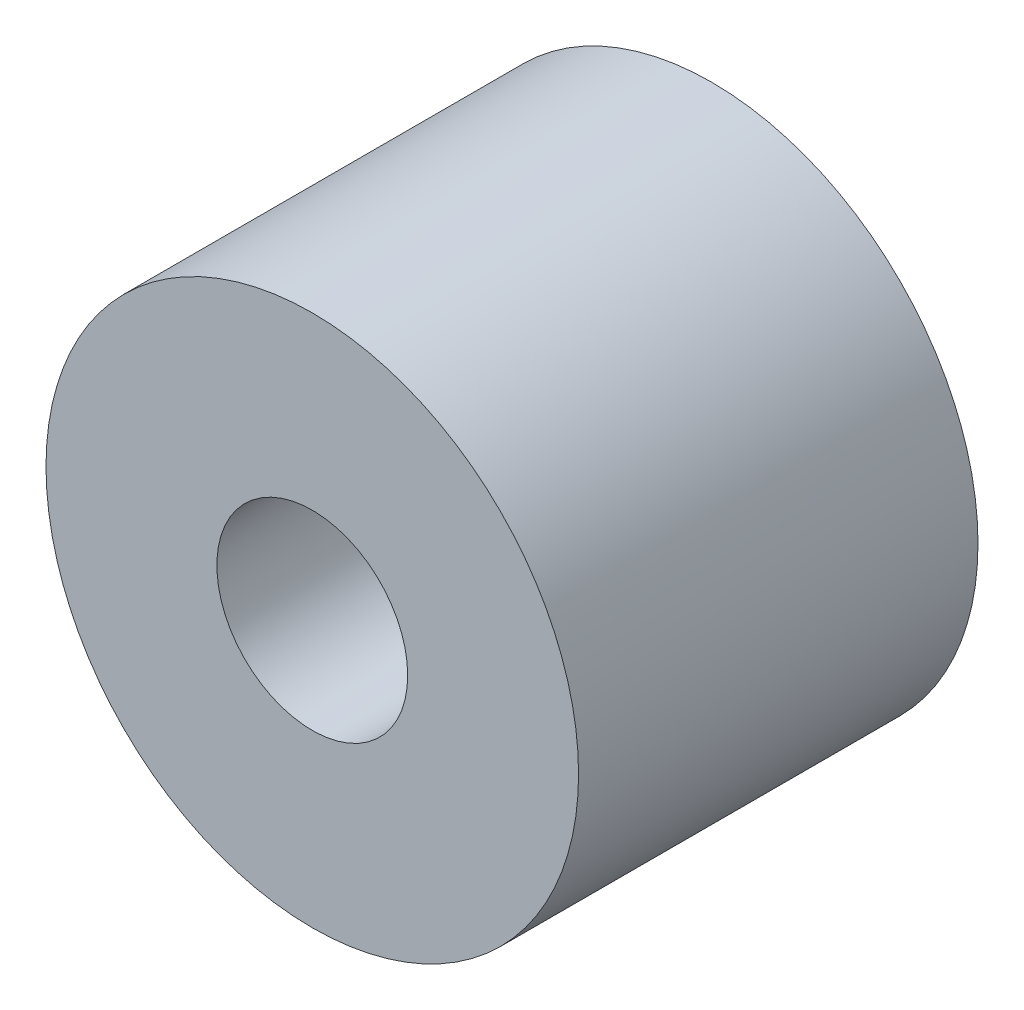
ISO-10303-21;
HEADER;
FILE_DESCRIPTION(('STEP AP214'),'2;1');
FILE_NAME('part.step','',(''),(''),'','','');
FILE_SCHEMA(('AUTOMOTIVE_DESIGN { 1 0 10303 214 1 1 1 1 }'));
ENDSEC;
DATA;
#1=APPLICATION_CONTEXT('core data for automotive mechanical design processes');
#2=APPLICATION_PROTOCOL_DEFINITION('international standard','automotive_design',2000,#1);
#3=PRODUCT_CONTEXT('',#1,'mechanical');
#4=PRODUCT('Part','Part','',(#3));
#5=PRODUCT_RELATED_PRODUCT_CATEGORY('part','',(#4));
#6=PRODUCT_DEFINITION_FORMATION('','',#4);
#7=PRODUCT_DEFINITION_CONTEXT('part definition',#1,'design');
#8=PRODUCT_DEFINITION('design','',#6,#7);
#9=PRODUCT_DEFINITION_SHAPE('','',#8);
#10=(LENGTH_UNIT() NAMED_UNIT(*) SI_UNIT(.MILLI.,.METRE.));
#11=(NAMED_UNIT(*) PLANE_ANGLE_UNIT() SI_UNIT($,.RADIAN.));
#12=(NAMED_UNIT(*) SI_UNIT($,.STERADIAN.) SOLID_ANGLE_UNIT());
#13=UNCERTAINTY_MEASURE_WITH_UNIT(LENGTH_MEASURE(1.E-05),#10,'distance_accuracy_value','');
#14=(GEOMETRIC_REPRESENTATION_CONTEXT(3) GLOBAL_UNCERTAINTY_ASSIGNED_CONTEXT((#13)) GLOBAL_UNIT_ASSIGNED_CONTEXT((#10,
#11,#12)) REPRESENTATION_CONTEXT('',''));
#15=CARTESIAN_POINT('',(0.,0.,0.));
#16=DIRECTION('',(0.,0.,1.));
#17=DIRECTION('',(1.,0.,0.));
#18=AXIS2_PLACEMENT_3D('',#15,#16,#17);
#19=CARTESIAN_POINT('',(0.,0.,9.));
#20=DIRECTION('',(0.,0.,1.));
#21=DIRECTION('',(1.,0.,0.));
#22=AXIS2_PLACEMENT_3D('',#19,#20,#21);
#23=PLANE('',#22);
#24=CARTESIAN_POINT('',(0.,0.,9.));
#25=DIRECTION('',(0.,0.,1.));
#26=DIRECTION('',(1.,0.,0.));
#27=AXIS2_PLACEMENT_3D('',#24,#25,#26);
#28=CIRCLE('',#27,6.);
#29=CARTESIAN_POINT('',(6.,0.,9.));
#30=VERTEX_POINT('',#29);
#31=EDGE_CURVE('E10',#30,#30,#28,.T.);
#32=ORIENTED_EDGE('',*,*,#31,.T.);
#33=EDGE_LOOP('',(#32));
#34=FACE_BOUND('',#33,.T.);
#35=CARTESIAN_POINT('',(0.,0.,9.));
#36=DIRECTION('',(0.,0.,1.));
#37=DIRECTION('',(1.,0.,0.));
#38=AXIS2_PLACEMENT_3D('',#35,#36,#37);
#39=CIRCLE('',#38,2.15);
#40=CARTESIAN_POINT('',(2.15,0.,9.));
#41=VERTEX_POINT('',#40);
#42=EDGE_CURVE('E50',#41,#41,#39,.T.);
#43=ORIENTED_EDGE('',*,*,#42,.F.);
#44=EDGE_LOOP('',(#43));
#45=FACE_BOUND('',#44,.T.);
#46=ADVANCED_FACE('F39',(#34,#45),#23,.T.);
#47=CARTESIAN_POINT('',(0.,0.,0.));
#48=DIRECTION('',(0.,0.,1.));
#49=DIRECTION('',(1.,0.,0.));
#50=AXIS2_PLACEMENT_3D('',#47,#48,#49);
#51=PLANE('',#50);
#52=CARTESIAN_POINT('',(0.,0.,0.));
#53=DIRECTION('',(0.,0.,1.));
#54=DIRECTION('',(1.,0.,0.));
#55=AXIS2_PLACEMENT_3D('',#52,#53,#54);
#56=CIRCLE('',#55,6.);
#57=CARTESIAN_POINT('',(6.,0.,0.));
#58=VERTEX_POINT('',#57);
#59=EDGE_CURVE('E43',#58,#58,#56,.T.);
#60=ORIENTED_EDGE('',*,*,#59,.F.);
#61=EDGE_LOOP('',(#60));
#62=FACE_BOUND('',#61,.T.);
#63=CARTESIAN_POINT('',(0.,0.,0.));
#64=DIRECTION('',(0.,0.,1.));
#65=DIRECTION('',(1.,0.,0.));
#66=AXIS2_PLACEMENT_3D('',#63,#64,#65);
#67=CIRCLE('',#66,2.15);
#68=CARTESIAN_POINT('',(2.15,0.,0.));
#69=VERTEX_POINT('',#68);
#70=EDGE_CURVE('E52',#69,#69,#67,.T.);
#71=ORIENTED_EDGE('',*,*,#70,.T.);
#72=EDGE_LOOP('',(#71));
#73=FACE_BOUND('',#72,.T.);
#74=ADVANCED_FACE('F62',(#62,#73),#51,.F.);
#75=CARTESIAN_POINT('',(0.,0.,9.));
#76=DIRECTION('',(0.,0.,-1.));
#77=DIRECTION('',(-1.,0.,0.));
#78=AXIS2_PLACEMENT_3D('',#75,#76,#77);
#79=CYLINDRICAL_SURFACE('',#78,6.);
#80=ORIENTED_EDGE('',*,*,#31,.F.);
#81=EDGE_LOOP('',(#80));
#82=FACE_BOUND('',#81,.T.);
#83=ORIENTED_EDGE('',*,*,#59,.T.);
#84=EDGE_LOOP('',(#83));
#85=FACE_BOUND('',#84,.T.);
#86=ADVANCED_FACE('F41',(#82,#85),#79,.T.);
#87=CARTESIAN_POINT('',(0.,0.,9.));
#88=DIRECTION('',(0.,0.,-1.));
#89=DIRECTION('',(-1.,0.,0.));
#90=AXIS2_PLACEMENT_3D('',#87,#88,#89);
#91=CYLINDRICAL_SURFACE('',#90,2.15);
#92=ORIENTED_EDGE('',*,*,#42,.T.);
#93=EDGE_LOOP('',(#92));
#94=FACE_BOUND('',#93,.T.);
#95=ORIENTED_EDGE('',*,*,#70,.F.);
#96=EDGE_LOOP('',(#95));
#97=FACE_BOUND('',#96,.T.);
#98=ADVANCED_FACE('F58',(#94,#97),#91,.F.);
#99=CLOSED_SHELL('',(#46,#74,#86,#98));
#100=MANIFOLD_SOLID_BREP('B2',#99);
#101=ADVANCED_BREP_SHAPE_REPRESENTATION('',(#18,#100),#14);
#102=SHAPE_DEFINITION_REPRESENTATION(#9,#101);
ENDSEC;
END-ISO-10303-21;
